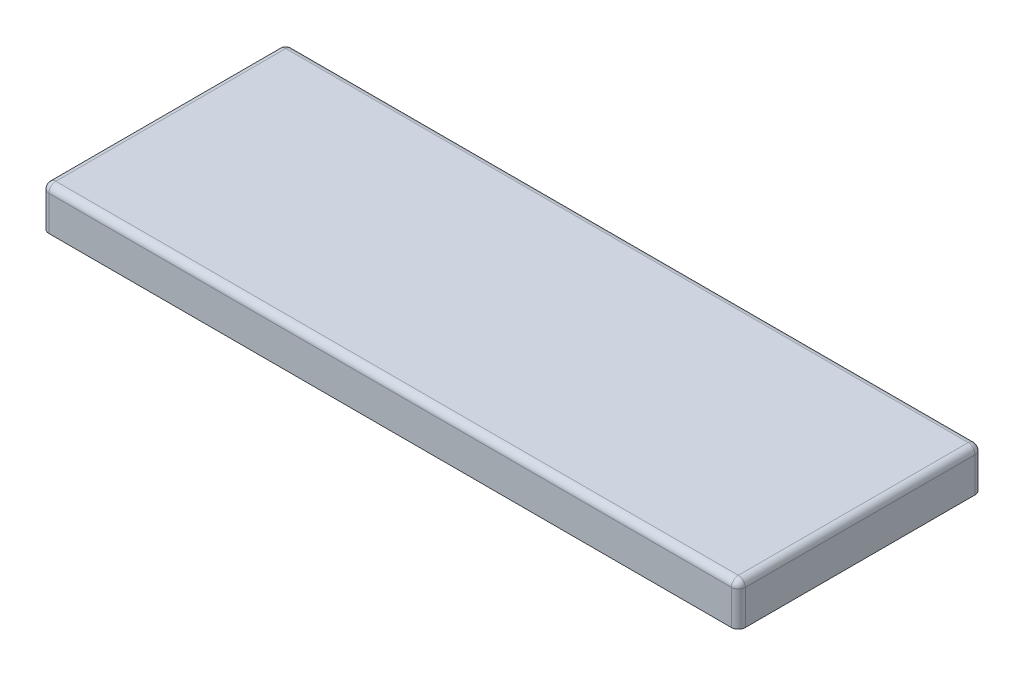
ISO-10303-21;
HEADER;
FILE_DESCRIPTION(('STEP AP214'),'2;1');
FILE_NAME('part.step','',(''),(''),'','','');
FILE_SCHEMA(('AUTOMOTIVE_DESIGN { 1 0 10303 214 1 1 1 1 }'));
ENDSEC;
DATA;
#1=APPLICATION_CONTEXT('core data for automotive mechanical design processes');
#2=APPLICATION_PROTOCOL_DEFINITION('international standard','automotive_design',2000,#1);
#3=PRODUCT_CONTEXT('',#1,'mechanical');
#4=PRODUCT('Part','Part','',(#3));
#5=PRODUCT_RELATED_PRODUCT_CATEGORY('part','',(#4));
#6=PRODUCT_DEFINITION_FORMATION('','',#4);
#7=PRODUCT_DEFINITION_CONTEXT('part definition',#1,'design');
#8=PRODUCT_DEFINITION('design','',#6,#7);
#9=PRODUCT_DEFINITION_SHAPE('','',#8);
#10=(LENGTH_UNIT() NAMED_UNIT(*) SI_UNIT(.MILLI.,.METRE.));
#11=(NAMED_UNIT(*) PLANE_ANGLE_UNIT() SI_UNIT($,.RADIAN.));
#12=(NAMED_UNIT(*) SI_UNIT($,.STERADIAN.) SOLID_ANGLE_UNIT());
#13=UNCERTAINTY_MEASURE_WITH_UNIT(LENGTH_MEASURE(1.E-05),#10,'distance_accuracy_value','');
#14=(GEOMETRIC_REPRESENTATION_CONTEXT(3) GLOBAL_UNCERTAINTY_ASSIGNED_CONTEXT((#13)) GLOBAL_UNIT_ASSIGNED_CONTEXT((#10,
#11,#12)) REPRESENTATION_CONTEXT('',''));
#15=CARTESIAN_POINT('',(0.,0.,0.));
#16=DIRECTION('',(0.,0.,1.));
#17=DIRECTION('',(1.,0.,0.));
#18=AXIS2_PLACEMENT_3D('',#15,#16,#17);
#19=CARTESIAN_POINT('',(0.,-10.,0.));
#20=DIRECTION('',(0.,-1.,0.));
#21=DIRECTION('',(0.,0.,-1.));
#22=AXIS2_PLACEMENT_3D('',#19,#20,#21);
#23=PLANE('',#22);
#24=DIRECTION('',(1.,0.,0.));
#25=VECTOR('',#24,1.);
#26=CARTESIAN_POINT('',(-100.,-10.,35.));
#27=LINE('',#26,#25);
#28=CARTESIAN_POINT('',(-98.,-10.,35.));
#29=VERTEX_POINT('',#28);
#30=CARTESIAN_POINT('',(98.,-10.,35.));
#31=VERTEX_POINT('',#30);
#32=EDGE_CURVE('E185',#29,#31,#27,.T.);
#33=ORIENTED_EDGE('',*,*,#32,.F.);
#34=CARTESIAN_POINT('',(-98.,-10.,33.));
#35=DIRECTION('',(0.,-1.,0.));
#36=DIRECTION('',(0.,0.,-1.));
#37=AXIS2_PLACEMENT_3D('',#34,#35,#36);
#38=CIRCLE('',#37,2.);
#39=CARTESIAN_POINT('',(-100.,-10.,33.));
#40=VERTEX_POINT('',#39);
#41=EDGE_CURVE('E207',#29,#40,#38,.T.);
#42=ORIENTED_EDGE('',*,*,#41,.T.);
#43=DIRECTION('',(0.,0.,1.));
#44=VECTOR('',#43,1.);
#45=CARTESIAN_POINT('',(-100.,-10.,35.));
#46=LINE('',#45,#44);
#47=CARTESIAN_POINT('',(-100.,-10.,-33.));
#48=VERTEX_POINT('',#47);
#49=EDGE_CURVE('E182',#48,#40,#46,.T.);
#50=ORIENTED_EDGE('',*,*,#49,.F.);
#51=CARTESIAN_POINT('',(-98.,-10.,-33.));
#52=DIRECTION('',(0.,-1.,0.));
#53=DIRECTION('',(0.,0.,-1.));
#54=AXIS2_PLACEMENT_3D('',#51,#52,#53);
#55=CIRCLE('',#54,2.);
#56=CARTESIAN_POINT('',(-98.,-10.,-35.));
#57=VERTEX_POINT('',#56);
#58=EDGE_CURVE('E205',#48,#57,#55,.T.);
#59=ORIENTED_EDGE('',*,*,#58,.T.);
#60=DIRECTION('',(-1.,0.,0.));
#61=VECTOR('',#60,1.);
#62=CARTESIAN_POINT('',(-100.,-10.,-35.));
#63=LINE('',#62,#61);
#64=CARTESIAN_POINT('',(98.,-10.,-35.));
#65=VERTEX_POINT('',#64);
#66=EDGE_CURVE('E179',#65,#57,#63,.T.);
#67=ORIENTED_EDGE('',*,*,#66,.F.);
#68=CARTESIAN_POINT('',(98.,-10.,-33.));
#69=DIRECTION('',(0.,-1.,0.));
#70=DIRECTION('',(0.,0.,-1.));
#71=AXIS2_PLACEMENT_3D('',#68,#69,#70);
#72=CIRCLE('',#71,2.);
#73=CARTESIAN_POINT('',(100.,-10.,-33.));
#74=VERTEX_POINT('',#73);
#75=EDGE_CURVE('E203',#65,#74,#72,.T.);
#76=ORIENTED_EDGE('',*,*,#75,.T.);
#77=DIRECTION('',(0.,0.,-1.));
#78=VECTOR('',#77,1.);
#79=CARTESIAN_POINT('',(100.,-10.,35.));
#80=LINE('',#79,#78);
#81=CARTESIAN_POINT('',(100.,-10.,33.));
#82=VERTEX_POINT('',#81);
#83=EDGE_CURVE('E176',#82,#74,#80,.T.);
#84=ORIENTED_EDGE('',*,*,#83,.F.);
#85=CARTESIAN_POINT('',(98.,-10.,33.));
#86=DIRECTION('',(0.,-1.,0.));
#87=DIRECTION('',(0.,0.,-1.));
#88=AXIS2_PLACEMENT_3D('',#85,#86,#87);
#89=CIRCLE('',#88,2.);
#90=EDGE_CURVE('E201',#82,#31,#89,.T.);
#91=ORIENTED_EDGE('',*,*,#90,.T.);
#92=EDGE_LOOP('',(#33,#42,#50,#59,#67,#76,#84,#91));
#93=FACE_BOUND('',#92,.T.);
#94=DIRECTION('',(0.,0.,1.));
#95=VECTOR('',#94,1.);
#96=CARTESIAN_POINT('',(-98.,-10.,35.));
#97=LINE('',#96,#95);
#98=CARTESIAN_POINT('',(-98.,-10.,-33.));
#99=VERTEX_POINT('',#98);
#100=CARTESIAN_POINT('',(-98.,-10.,33.));
#101=VERTEX_POINT('',#100);
#102=EDGE_CURVE('E172',#99,#101,#97,.T.);
#103=ORIENTED_EDGE('',*,*,#102,.T.);
#104=DIRECTION('',(1.,0.,0.));
#105=VECTOR('',#104,1.);
#106=CARTESIAN_POINT('',(-100.,-10.,33.));
#107=LINE('',#106,#105);
#108=CARTESIAN_POINT('',(98.,-10.,33.));
#109=VERTEX_POINT('',#108);
#110=EDGE_CURVE('E166',#101,#109,#107,.T.);
#111=ORIENTED_EDGE('',*,*,#110,.T.);
#112=DIRECTION('',(0.,0.,-1.));
#113=VECTOR('',#112,1.);
#114=CARTESIAN_POINT('',(98.,-10.,35.));
#115=LINE('',#114,#113);
#116=CARTESIAN_POINT('',(98.,-10.,-33.));
#117=VERTEX_POINT('',#116);
#118=EDGE_CURVE('E168',#109,#117,#115,.T.);
#119=ORIENTED_EDGE('',*,*,#118,.T.);
#120=DIRECTION('',(-1.,0.,0.));
#121=VECTOR('',#120,1.);
#122=CARTESIAN_POINT('',(-100.,-10.,-33.));
#123=LINE('',#122,#121);
#124=EDGE_CURVE('E52',#117,#99,#123,.T.);
#125=ORIENTED_EDGE('',*,*,#124,.T.);
#126=EDGE_LOOP('',(#103,#111,#119,#125));
#127=FACE_BOUND('',#126,.T.);
#128=ADVANCED_FACE('F35',(#93,#127),#23,.T.);
#129=CARTESIAN_POINT('',(100.,-10.,35.));
#130=DIRECTION('',(1.,0.,0.));
#131=DIRECTION('',(0.,0.,-1.));
#132=AXIS2_PLACEMENT_3D('',#129,#130,#131);
#133=PLANE('',#132);
#134=ORIENTED_EDGE('',*,*,#83,.T.);
#135=DIRECTION('',(0.,1.,0.));
#136=VECTOR('',#135,1.);
#137=CARTESIAN_POINT('',(100.,-10.,-33.));
#138=LINE('',#137,#136);
#139=CARTESIAN_POINT('',(100.,0.,-33.));
#140=VERTEX_POINT('',#139);
#141=EDGE_CURVE('E219',#74,#140,#138,.T.);
#142=ORIENTED_EDGE('',*,*,#141,.T.);
#143=DIRECTION('',(0.,0.,-1.));
#144=VECTOR('',#143,1.);
#145=CARTESIAN_POINT('',(100.,0.,35.));
#146=LINE('',#145,#144);
#147=CARTESIAN_POINT('',(100.,0.,33.));
#148=VERTEX_POINT('',#147);
#149=EDGE_CURVE('E215',#140,#148,#146,.F.);
#150=ORIENTED_EDGE('',*,*,#149,.T.);
#151=DIRECTION('',(0.,1.,0.));
#152=VECTOR('',#151,1.);
#153=CARTESIAN_POINT('',(100.,-10.,33.));
#154=LINE('',#153,#152);
#155=EDGE_CURVE('E217',#148,#82,#154,.F.);
#156=ORIENTED_EDGE('',*,*,#155,.T.);
#157=EDGE_LOOP('',(#134,#142,#150,#156));
#158=FACE_BOUND('',#157,.T.);
#159=ADVANCED_FACE('F306',(#158),#133,.T.);
#160=CARTESIAN_POINT('',(-100.,-10.,35.));
#161=DIRECTION('',(0.,0.,1.));
#162=DIRECTION('',(1.,0.,0.));
#163=AXIS2_PLACEMENT_3D('',#160,#161,#162);
#164=PLANE('',#163);
#165=DIRECTION('',(1.,0.,0.));
#166=VECTOR('',#165,1.);
#167=CARTESIAN_POINT('',(-100.,0.,35.));
#168=LINE('',#167,#166);
#169=CARTESIAN_POINT('',(98.,0.,35.));
#170=VERTEX_POINT('',#169);
#171=CARTESIAN_POINT('',(-98.,0.,35.));
#172=VERTEX_POINT('',#171);
#173=EDGE_CURVE('E195',#170,#172,#168,.F.);
#174=ORIENTED_EDGE('',*,*,#173,.T.);
#175=DIRECTION('',(0.,1.,0.));
#176=VECTOR('',#175,1.);
#177=CARTESIAN_POINT('',(-98.,-10.,35.));
#178=LINE('',#177,#176);
#179=EDGE_CURVE('E199',#172,#29,#178,.F.);
#180=ORIENTED_EDGE('',*,*,#179,.T.);
#181=ORIENTED_EDGE('',*,*,#32,.T.);
#182=DIRECTION('',(0.,1.,0.));
#183=VECTOR('',#182,1.);
#184=CARTESIAN_POINT('',(98.,-10.,35.));
#185=LINE('',#184,#183);
#186=EDGE_CURVE('E197',#31,#170,#185,.T.);
#187=ORIENTED_EDGE('',*,*,#186,.T.);
#188=EDGE_LOOP('',(#174,#180,#181,#187));
#189=FACE_BOUND('',#188,.T.);
#190=ADVANCED_FACE('F313',(#189),#164,.T.);
#191=CARTESIAN_POINT('',(-100.,-10.,35.));
#192=DIRECTION('',(-1.,0.,0.));
#193=DIRECTION('',(0.,0.,1.));
#194=AXIS2_PLACEMENT_3D('',#191,#192,#193);
#195=PLANE('',#194);
#196=ORIENTED_EDGE('',*,*,#49,.T.);
#197=DIRECTION('',(0.,1.,0.));
#198=VECTOR('',#197,1.);
#199=CARTESIAN_POINT('',(-100.,-10.,33.));
#200=LINE('',#199,#198);
#201=CARTESIAN_POINT('',(-100.,0.,33.));
#202=VERTEX_POINT('',#201);
#203=EDGE_CURVE('E192',#40,#202,#200,.T.);
#204=ORIENTED_EDGE('',*,*,#203,.T.);
#205=DIRECTION('',(0.,0.,1.));
#206=VECTOR('',#205,1.);
#207=CARTESIAN_POINT('',(-100.,0.,-35.));
#208=LINE('',#207,#206);
#209=CARTESIAN_POINT('',(-100.,0.,-33.));
#210=VERTEX_POINT('',#209);
#211=EDGE_CURVE('E188',#202,#210,#208,.F.);
#212=ORIENTED_EDGE('',*,*,#211,.T.);
#213=DIRECTION('',(0.,1.,0.));
#214=VECTOR('',#213,1.);
#215=CARTESIAN_POINT('',(-100.,-10.,-33.));
#216=LINE('',#215,#214);
#217=EDGE_CURVE('E190',#210,#48,#216,.F.);
#218=ORIENTED_EDGE('',*,*,#217,.T.);
#219=EDGE_LOOP('',(#196,#204,#212,#218));
#220=FACE_BOUND('',#219,.T.);
#221=ADVANCED_FACE('F321',(#220),#195,.T.);
#222=CARTESIAN_POINT('',(-100.,-10.,-35.));
#223=DIRECTION('',(0.,0.,-1.));
#224=DIRECTION('',(-1.,0.,0.));
#225=AXIS2_PLACEMENT_3D('',#222,#223,#224);
#226=PLANE('',#225);
#227=ORIENTED_EDGE('',*,*,#66,.T.);
#228=DIRECTION('',(0.,1.,0.));
#229=VECTOR('',#228,1.);
#230=CARTESIAN_POINT('',(-98.,-10.,-35.));
#231=LINE('',#230,#229);
#232=CARTESIAN_POINT('',(-98.,0.,-35.));
#233=VERTEX_POINT('',#232);
#234=EDGE_CURVE('E213',#57,#233,#231,.T.);
#235=ORIENTED_EDGE('',*,*,#234,.T.);
#236=DIRECTION('',(-1.,0.,0.));
#237=VECTOR('',#236,1.);
#238=CARTESIAN_POINT('',(100.,0.,-35.));
#239=LINE('',#238,#237);
#240=CARTESIAN_POINT('',(98.,0.,-35.));
#241=VERTEX_POINT('',#240);
#242=EDGE_CURVE('E209',#233,#241,#239,.F.);
#243=ORIENTED_EDGE('',*,*,#242,.T.);
#244=DIRECTION('',(0.,1.,0.));
#245=VECTOR('',#244,1.);
#246=CARTESIAN_POINT('',(98.,-10.,-35.));
#247=LINE('',#246,#245);
#248=EDGE_CURVE('E211',#241,#65,#247,.F.);
#249=ORIENTED_EDGE('',*,*,#248,.T.);
#250=EDGE_LOOP('',(#227,#235,#243,#249));
#251=FACE_BOUND('',#250,.T.);
#252=ADVANCED_FACE('F267',(#251),#226,.T.);
#253=CARTESIAN_POINT('',(0.,2.,0.));
#254=DIRECTION('',(0.,-1.,0.));
#255=DIRECTION('',(0.,0.,-1.));
#256=AXIS2_PLACEMENT_3D('',#253,#254,#255);
#257=PLANE('',#256);
#258=DIRECTION('',(1.,0.,0.));
#259=VECTOR('',#258,1.);
#260=CARTESIAN_POINT('',(100.,2.,33.));
#261=LINE('',#260,#259);
#262=CARTESIAN_POINT('',(-98.,2.,33.));
#263=VERTEX_POINT('',#262);
#264=CARTESIAN_POINT('',(98.,2.,33.));
#265=VERTEX_POINT('',#264);
#266=EDGE_CURVE('E221',#263,#265,#261,.T.);
#267=ORIENTED_EDGE('',*,*,#266,.T.);
#268=DIRECTION('',(0.,0.,-1.));
#269=VECTOR('',#268,1.);
#270=CARTESIAN_POINT('',(98.,2.,-35.));
#271=LINE('',#270,#269);
#272=CARTESIAN_POINT('',(98.,2.,-33.));
#273=VERTEX_POINT('',#272);
#274=EDGE_CURVE('E11',#265,#273,#271,.T.);
#275=ORIENTED_EDGE('',*,*,#274,.T.);
#276=DIRECTION('',(-1.,0.,0.));
#277=VECTOR('',#276,1.);
#278=CARTESIAN_POINT('',(-100.,2.,-33.));
#279=LINE('',#278,#277);
#280=CARTESIAN_POINT('',(-98.,2.,-33.));
#281=VERTEX_POINT('',#280);
#282=EDGE_CURVE('E44',#273,#281,#279,.T.);
#283=ORIENTED_EDGE('',*,*,#282,.T.);
#284=DIRECTION('',(0.,0.,1.));
#285=VECTOR('',#284,1.);
#286=CARTESIAN_POINT('',(-98.,2.,35.));
#287=LINE('',#286,#285);
#288=EDGE_CURVE('E223',#281,#263,#287,.T.);
#289=ORIENTED_EDGE('',*,*,#288,.T.);
#290=EDGE_LOOP('',(#267,#275,#283,#289));
#291=FACE_BOUND('',#290,.T.);
#292=ADVANCED_FACE('F290',(#291),#257,.F.);
#293=CARTESIAN_POINT('',(98.,-10.,-33.));
#294=DIRECTION('',(0.,1.,0.));
#295=DIRECTION('',(0.,0.,1.));
#296=AXIS2_PLACEMENT_3D('',#293,#294,#295);
#297=CYLINDRICAL_SURFACE('',#296,2.);
#298=CARTESIAN_POINT('',(98.,0.,-33.));
#299=DIRECTION('',(0.,1.,0.));
#300=DIRECTION('',(0.,0.,1.));
#301=AXIS2_PLACEMENT_3D('',#298,#299,#300);
#302=CIRCLE('',#301,2.);
#303=EDGE_CURVE('E39',#140,#241,#302,.T.);
#304=ORIENTED_EDGE('',*,*,#303,.F.);
#305=ORIENTED_EDGE('',*,*,#141,.F.);
#306=ORIENTED_EDGE('',*,*,#75,.F.);
#307=ORIENTED_EDGE('',*,*,#248,.F.);
#308=EDGE_LOOP('',(#304,#305,#306,#307));
#309=FACE_BOUND('',#308,.T.);
#310=ADVANCED_FACE('F37',(#309),#297,.T.);
#311=CARTESIAN_POINT('',(98.,0.,-33.));
#312=DIRECTION('',(0.,0.,1.));
#313=DIRECTION('',(1.,0.,0.));
#314=AXIS2_PLACEMENT_3D('',#311,#312,#313);
#315=SPHERICAL_SURFACE('',#314,2.);
#316=CARTESIAN_POINT('',(98.,0.,-33.));
#317=DIRECTION('',(0.,0.,-1.));
#318=DIRECTION('',(-1.,0.,0.));
#319=AXIS2_PLACEMENT_3D('',#316,#317,#318);
#320=CIRCLE('',#319,2.);
#321=EDGE_CURVE('E251',#140,#273,#320,.F.);
#322=ORIENTED_EDGE('',*,*,#321,.F.);
#323=ORIENTED_EDGE('',*,*,#303,.T.);
#324=CARTESIAN_POINT('',(98.,0.,-33.));
#325=DIRECTION('',(1.,0.,0.));
#326=DIRECTION('',(0.,0.,-1.));
#327=AXIS2_PLACEMENT_3D('',#324,#325,#326);
#328=CIRCLE('',#327,2.);
#329=EDGE_CURVE('E253',#273,#241,#328,.F.);
#330=ORIENTED_EDGE('',*,*,#329,.F.);
#331=EDGE_LOOP('',(#322,#323,#330));
#332=FACE_BOUND('',#331,.T.);
#333=ADVANCED_FACE('F259',(#332),#315,.T.);
#334=CARTESIAN_POINT('',(-98.,-10.,-33.));
#335=DIRECTION('',(0.,1.,0.));
#336=DIRECTION('',(0.,0.,1.));
#337=AXIS2_PLACEMENT_3D('',#334,#335,#336);
#338=CYLINDRICAL_SURFACE('',#337,2.);
#339=ORIENTED_EDGE('',*,*,#58,.F.);
#340=ORIENTED_EDGE('',*,*,#217,.F.);
#341=CARTESIAN_POINT('',(-98.,0.,-33.));
#342=DIRECTION('',(0.,1.,0.));
#343=DIRECTION('',(0.,0.,1.));
#344=AXIS2_PLACEMENT_3D('',#341,#342,#343);
#345=CIRCLE('',#344,2.);
#346=EDGE_CURVE('E248',#233,#210,#345,.T.);
#347=ORIENTED_EDGE('',*,*,#346,.F.);
#348=ORIENTED_EDGE('',*,*,#234,.F.);
#349=EDGE_LOOP('',(#339,#340,#347,#348));
#350=FACE_BOUND('',#349,.T.);
#351=ADVANCED_FACE('F277',(#350),#338,.T.);
#352=CARTESIAN_POINT('',(0.,0.,-33.));
#353=DIRECTION('',(1.,0.,0.));
#354=DIRECTION('',(0.,0.,-1.));
#355=AXIS2_PLACEMENT_3D('',#352,#353,#354);
#356=CYLINDRICAL_SURFACE('',#355,2.);
#357=ORIENTED_EDGE('',*,*,#329,.T.);
#358=ORIENTED_EDGE('',*,*,#242,.F.);
#359=CARTESIAN_POINT('',(-98.,0.,-33.));
#360=DIRECTION('',(-1.,0.,0.));
#361=DIRECTION('',(0.,0.,1.));
#362=AXIS2_PLACEMENT_3D('',#359,#360,#361);
#363=CIRCLE('',#362,2.);
#364=EDGE_CURVE('E245',#281,#233,#363,.T.);
#365=ORIENTED_EDGE('',*,*,#364,.F.);
#366=ORIENTED_EDGE('',*,*,#282,.F.);
#367=EDGE_LOOP('',(#357,#358,#365,#366));
#368=FACE_BOUND('',#367,.T.);
#369=ADVANCED_FACE('F279',(#368),#356,.T.);
#370=CARTESIAN_POINT('',(98.,0.,0.));
#371=DIRECTION('',(0.,0.,1.));
#372=DIRECTION('',(1.,0.,0.));
#373=AXIS2_PLACEMENT_3D('',#370,#371,#372);
#374=CYLINDRICAL_SURFACE('',#373,2.);
#375=ORIENTED_EDGE('',*,*,#321,.T.);
#376=ORIENTED_EDGE('',*,*,#274,.F.);
#377=CARTESIAN_POINT('',(98.,0.,33.));
#378=DIRECTION('',(0.,0.,1.));
#379=DIRECTION('',(1.,0.,0.));
#380=AXIS2_PLACEMENT_3D('',#377,#378,#379);
#381=CIRCLE('',#380,2.);
#382=EDGE_CURVE('E242',#148,#265,#381,.T.);
#383=ORIENTED_EDGE('',*,*,#382,.F.);
#384=ORIENTED_EDGE('',*,*,#149,.F.);
#385=EDGE_LOOP('',(#375,#376,#383,#384));
#386=FACE_BOUND('',#385,.T.);
#387=ADVANCED_FACE('F303',(#386),#374,.T.);
#388=CARTESIAN_POINT('',(98.,-10.,33.));
#389=DIRECTION('',(0.,1.,0.));
#390=DIRECTION('',(0.,0.,1.));
#391=AXIS2_PLACEMENT_3D('',#388,#389,#390);
#392=CYLINDRICAL_SURFACE('',#391,2.);
#393=ORIENTED_EDGE('',*,*,#90,.F.);
#394=ORIENTED_EDGE('',*,*,#155,.F.);
#395=CARTESIAN_POINT('',(98.,0.,33.));
#396=DIRECTION('',(0.,1.,0.));
#397=DIRECTION('',(0.,0.,1.));
#398=AXIS2_PLACEMENT_3D('',#395,#396,#397);
#399=CIRCLE('',#398,2.);
#400=EDGE_CURVE('E239',#170,#148,#399,.T.);
#401=ORIENTED_EDGE('',*,*,#400,.F.);
#402=ORIENTED_EDGE('',*,*,#186,.F.);
#403=EDGE_LOOP('',(#393,#394,#401,#402));
#404=FACE_BOUND('',#403,.T.);
#405=ADVANCED_FACE('F309',(#404),#392,.T.);
#406=CARTESIAN_POINT('',(-98.,0.,-33.));
#407=DIRECTION('',(0.,0.,1.));
#408=DIRECTION('',(1.,0.,0.));
#409=AXIS2_PLACEMENT_3D('',#406,#407,#408);
#410=SPHERICAL_SURFACE('',#409,2.);
#411=ORIENTED_EDGE('',*,*,#364,.T.);
#412=ORIENTED_EDGE('',*,*,#346,.T.);
#413=CARTESIAN_POINT('',(-98.,0.,-33.));
#414=DIRECTION('',(0.,0.,-1.));
#415=DIRECTION('',(-1.,0.,0.));
#416=AXIS2_PLACEMENT_3D('',#413,#414,#415);
#417=CIRCLE('',#416,2.);
#418=EDGE_CURVE('E236',#281,#210,#417,.F.);
#419=ORIENTED_EDGE('',*,*,#418,.F.);
#420=EDGE_LOOP('',(#411,#412,#419));
#421=FACE_BOUND('',#420,.T.);
#422=ADVANCED_FACE('F283',(#421),#410,.T.);
#423=CARTESIAN_POINT('',(98.,0.,33.));
#424=DIRECTION('',(0.,0.,1.));
#425=DIRECTION('',(1.,0.,0.));
#426=AXIS2_PLACEMENT_3D('',#423,#424,#425);
#427=SPHERICAL_SURFACE('',#426,2.);
#428=ORIENTED_EDGE('',*,*,#400,.T.);
#429=ORIENTED_EDGE('',*,*,#382,.T.);
#430=CARTESIAN_POINT('',(98.,0.,33.));
#431=DIRECTION('',(1.,0.,0.));
#432=DIRECTION('',(0.,0.,-1.));
#433=AXIS2_PLACEMENT_3D('',#430,#431,#432);
#434=CIRCLE('',#433,2.);
#435=EDGE_CURVE('E233',#170,#265,#434,.F.);
#436=ORIENTED_EDGE('',*,*,#435,.F.);
#437=EDGE_LOOP('',(#428,#429,#436));
#438=FACE_BOUND('',#437,.T.);
#439=ADVANCED_FACE('F299',(#438),#427,.T.);
#440=CARTESIAN_POINT('',(-98.,0.,0.));
#441=DIRECTION('',(0.,0.,-1.));
#442=DIRECTION('',(-1.,0.,0.));
#443=AXIS2_PLACEMENT_3D('',#440,#441,#442);
#444=CYLINDRICAL_SURFACE('',#443,2.);
#445=ORIENTED_EDGE('',*,*,#418,.T.);
#446=ORIENTED_EDGE('',*,*,#211,.F.);
#447=CARTESIAN_POINT('',(-98.,0.,33.));
#448=DIRECTION('',(0.,0.,1.));
#449=DIRECTION('',(1.,0.,0.));
#450=AXIS2_PLACEMENT_3D('',#447,#448,#449);
#451=CIRCLE('',#450,2.);
#452=EDGE_CURVE('E230',#263,#202,#451,.T.);
#453=ORIENTED_EDGE('',*,*,#452,.F.);
#454=ORIENTED_EDGE('',*,*,#288,.F.);
#455=EDGE_LOOP('',(#445,#446,#453,#454));
#456=FACE_BOUND('',#455,.T.);
#457=ADVANCED_FACE('F287',(#456),#444,.T.);
#458=CARTESIAN_POINT('',(0.,0.,33.));
#459=DIRECTION('',(-1.,0.,0.));
#460=DIRECTION('',(0.,0.,1.));
#461=AXIS2_PLACEMENT_3D('',#458,#459,#460);
#462=CYLINDRICAL_SURFACE('',#461,2.);
#463=ORIENTED_EDGE('',*,*,#435,.T.);
#464=ORIENTED_EDGE('',*,*,#266,.F.);
#465=CARTESIAN_POINT('',(-98.,0.,33.));
#466=DIRECTION('',(-1.,0.,0.));
#467=DIRECTION('',(0.,0.,1.));
#468=AXIS2_PLACEMENT_3D('',#465,#466,#467);
#469=CIRCLE('',#468,2.);
#470=EDGE_CURVE('E227',#172,#263,#469,.T.);
#471=ORIENTED_EDGE('',*,*,#470,.F.);
#472=ORIENTED_EDGE('',*,*,#173,.F.);
#473=EDGE_LOOP('',(#463,#464,#471,#472));
#474=FACE_BOUND('',#473,.T.);
#475=ADVANCED_FACE('F294',(#474),#462,.T.);
#476=CARTESIAN_POINT('',(-98.,0.,33.));
#477=DIRECTION('',(0.,0.,1.));
#478=DIRECTION('',(1.,0.,0.));
#479=AXIS2_PLACEMENT_3D('',#476,#477,#478);
#480=SPHERICAL_SURFACE('',#479,2.);
#481=ORIENTED_EDGE('',*,*,#470,.T.);
#482=ORIENTED_EDGE('',*,*,#452,.T.);
#483=CARTESIAN_POINT('',(-98.,0.,33.));
#484=DIRECTION('',(0.,1.,0.));
#485=DIRECTION('',(0.,0.,1.));
#486=AXIS2_PLACEMENT_3D('',#483,#484,#485);
#487=CIRCLE('',#486,2.);
#488=EDGE_CURVE('E147',#172,#202,#487,.F.);
#489=ORIENTED_EDGE('',*,*,#488,.F.);
#490=EDGE_LOOP('',(#481,#482,#489));
#491=FACE_BOUND('',#490,.T.);
#492=ADVANCED_FACE('F319',(#491),#480,.T.);
#493=CARTESIAN_POINT('',(-98.,-10.,33.));
#494=DIRECTION('',(0.,1.,0.));
#495=DIRECTION('',(0.,0.,1.));
#496=AXIS2_PLACEMENT_3D('',#493,#494,#495);
#497=CYLINDRICAL_SURFACE('',#496,2.);
#498=ORIENTED_EDGE('',*,*,#41,.F.);
#499=ORIENTED_EDGE('',*,*,#179,.F.);
#500=ORIENTED_EDGE('',*,*,#488,.T.);
#501=ORIENTED_EDGE('',*,*,#203,.F.);
#502=EDGE_LOOP('',(#498,#499,#500,#501));
#503=FACE_BOUND('',#502,.T.);
#504=ADVANCED_FACE('F316',(#503),#497,.T.);
#505=CARTESIAN_POINT('',(98.,-10.,35.));
#506=DIRECTION('',(1.,0.,0.));
#507=DIRECTION('',(0.,0.,-1.));
#508=AXIS2_PLACEMENT_3D('',#505,#506,#507);
#509=PLANE('',#508);
#510=ORIENTED_EDGE('',*,*,#118,.F.);
#511=DIRECTION('',(0.,-1.,0.));
#512=VECTOR('',#511,1.);
#513=CARTESIAN_POINT('',(98.,-10.,33.));
#514=LINE('',#513,#512);
#515=CARTESIAN_POINT('',(98.,0.,33.));
#516=VERTEX_POINT('',#515);
#517=EDGE_CURVE('E144',#516,#109,#514,.T.);
#518=ORIENTED_EDGE('',*,*,#517,.F.);
#519=DIRECTION('',(0.,0.,-1.));
#520=VECTOR('',#519,1.);
#521=CARTESIAN_POINT('',(98.,0.,35.));
#522=LINE('',#521,#520);
#523=CARTESIAN_POINT('',(98.,0.,-33.));
#524=VERTEX_POINT('',#523);
#525=EDGE_CURVE('E138',#516,#524,#522,.T.);
#526=ORIENTED_EDGE('',*,*,#525,.T.);
#527=DIRECTION('',(0.,1.,0.));
#528=VECTOR('',#527,1.);
#529=CARTESIAN_POINT('',(98.,-10.,-33.));
#530=LINE('',#529,#528);
#531=EDGE_CURVE('E142',#117,#524,#530,.T.);
#532=ORIENTED_EDGE('',*,*,#531,.F.);
#533=EDGE_LOOP('',(#510,#518,#526,#532));
#534=FACE_BOUND('',#533,.T.);
#535=ADVANCED_FACE('F141',(#534),#509,.F.);
#536=CARTESIAN_POINT('',(-100.,-10.,33.));
#537=DIRECTION('',(0.,0.,1.));
#538=DIRECTION('',(1.,0.,0.));
#539=AXIS2_PLACEMENT_3D('',#536,#537,#538);
#540=PLANE('',#539);
#541=DIRECTION('',(1.,0.,0.));
#542=VECTOR('',#541,1.);
#543=CARTESIAN_POINT('',(-100.,0.,33.));
#544=LINE('',#543,#542);
#545=CARTESIAN_POINT('',(-98.,0.,33.));
#546=VERTEX_POINT('',#545);
#547=EDGE_CURVE('E148',#546,#516,#544,.T.);
#548=ORIENTED_EDGE('',*,*,#547,.T.);
#549=ORIENTED_EDGE('',*,*,#517,.T.);
#550=ORIENTED_EDGE('',*,*,#110,.F.);
#551=DIRECTION('',(0.,-1.,0.));
#552=VECTOR('',#551,1.);
#553=CARTESIAN_POINT('',(-98.,-10.,33.));
#554=LINE('',#553,#552);
#555=EDGE_CURVE('E156',#546,#101,#554,.T.);
#556=ORIENTED_EDGE('',*,*,#555,.F.);
#557=EDGE_LOOP('',(#548,#549,#550,#556));
#558=FACE_BOUND('',#557,.T.);
#559=ADVANCED_FACE('F346',(#558),#540,.F.);
#560=CARTESIAN_POINT('',(-98.,-10.,35.));
#561=DIRECTION('',(-1.,0.,0.));
#562=DIRECTION('',(0.,0.,1.));
#563=AXIS2_PLACEMENT_3D('',#560,#561,#562);
#564=PLANE('',#563);
#565=ORIENTED_EDGE('',*,*,#102,.F.);
#566=DIRECTION('',(0.,-1.,0.));
#567=VECTOR('',#566,1.);
#568=CARTESIAN_POINT('',(-98.,-10.,-33.));
#569=LINE('',#568,#567);
#570=CARTESIAN_POINT('',(-98.,0.,-33.));
#571=VERTEX_POINT('',#570);
#572=EDGE_CURVE('E164',#571,#99,#569,.T.);
#573=ORIENTED_EDGE('',*,*,#572,.F.);
#574=DIRECTION('',(0.,0.,-1.));
#575=VECTOR('',#574,1.);
#576=CARTESIAN_POINT('',(-98.,0.,0.));
#577=LINE('',#576,#575);
#578=EDGE_CURVE('E154',#546,#571,#577,.T.);
#579=ORIENTED_EDGE('',*,*,#578,.F.);
#580=ORIENTED_EDGE('',*,*,#555,.T.);
#581=EDGE_LOOP('',(#565,#573,#579,#580));
#582=FACE_BOUND('',#581,.T.);
#583=ADVANCED_FACE('F343',(#582),#564,.F.);
#584=CARTESIAN_POINT('',(-100.,-10.,-33.));
#585=DIRECTION('',(0.,0.,-1.));
#586=DIRECTION('',(-1.,0.,0.));
#587=AXIS2_PLACEMENT_3D('',#584,#585,#586);
#588=PLANE('',#587);
#589=ORIENTED_EDGE('',*,*,#124,.F.);
#590=ORIENTED_EDGE('',*,*,#531,.T.);
#591=DIRECTION('',(1.,0.,0.));
#592=VECTOR('',#591,1.);
#593=CARTESIAN_POINT('',(0.,0.,-33.));
#594=LINE('',#593,#592);
#595=EDGE_CURVE('E151',#571,#524,#594,.T.);
#596=ORIENTED_EDGE('',*,*,#595,.F.);
#597=ORIENTED_EDGE('',*,*,#572,.T.);
#598=EDGE_LOOP('',(#589,#590,#596,#597));
#599=FACE_BOUND('',#598,.T.);
#600=ADVANCED_FACE('F158',(#599),#588,.F.);
#601=CARTESIAN_POINT('',(0.,0.,0.));
#602=DIRECTION('',(0.,-1.,0.));
#603=DIRECTION('',(0.,0.,-1.));
#604=AXIS2_PLACEMENT_3D('',#601,#602,#603);
#605=PLANE('',#604);
#606=ORIENTED_EDGE('',*,*,#547,.F.);
#607=ORIENTED_EDGE('',*,*,#578,.T.);
#608=ORIENTED_EDGE('',*,*,#595,.T.);
#609=ORIENTED_EDGE('',*,*,#525,.F.);
#610=EDGE_LOOP('',(#606,#607,#608,#609));
#611=FACE_BOUND('',#610,.T.);
#612=ADVANCED_FACE('F152',(#611),#605,.T.);
#613=CLOSED_SHELL('',(#128,#159,#190,#221,#252,#292,#310,#333,#351,#369,#387,#405,#422,#439,
#457,#475,#492,#504,#535,#559,#583,#600,#612));
#614=MANIFOLD_SOLID_BREP('B2',#613);
#615=ADVANCED_BREP_SHAPE_REPRESENTATION('',(#18,#614),#14);
#616=SHAPE_DEFINITION_REPRESENTATION(#9,#615);
ENDSEC;
END-ISO-10303-21;
